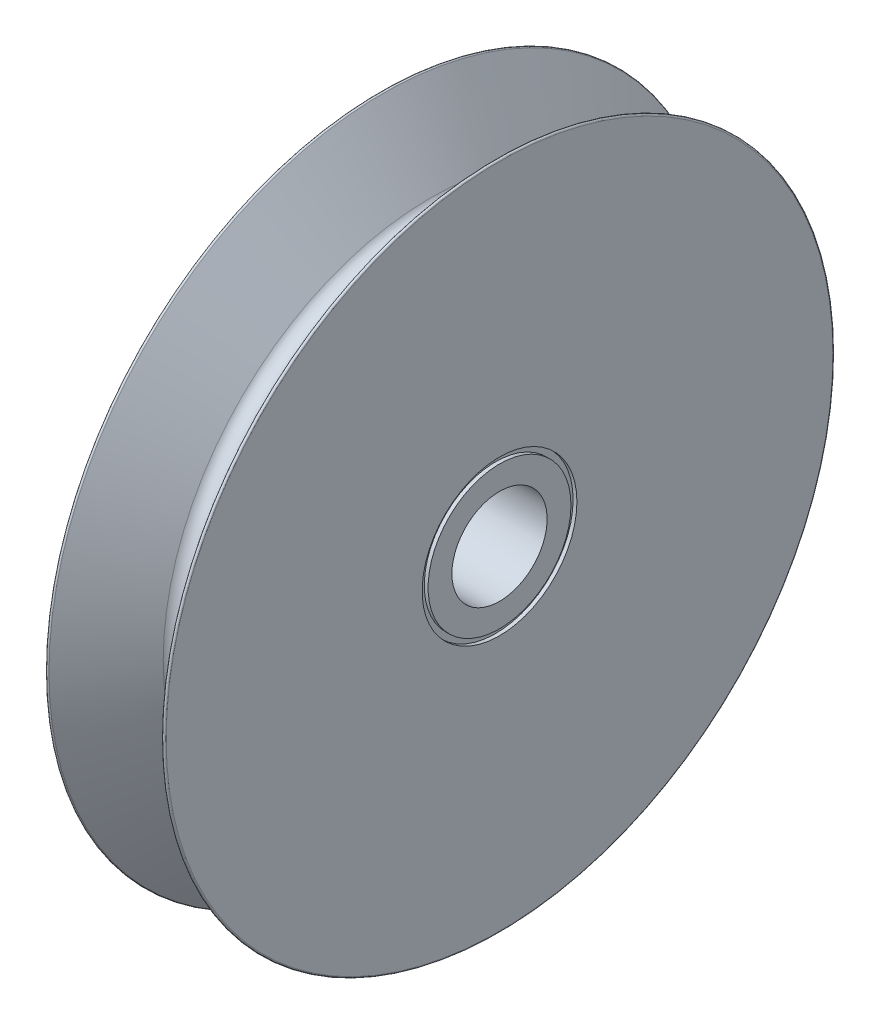
ISO-10303-21;
HEADER;
FILE_DESCRIPTION(('STEP AP214'),'2;1');
FILE_NAME('part.step','',(''),(''),'','','');
FILE_SCHEMA(('AUTOMOTIVE_DESIGN { 1 0 10303 214 1 1 1 1 }'));
ENDSEC;
DATA;
#1=APPLICATION_CONTEXT('core data for automotive mechanical design processes');
#2=APPLICATION_PROTOCOL_DEFINITION('international standard','automotive_design',2000,#1);
#3=PRODUCT_CONTEXT('',#1,'mechanical');
#4=PRODUCT('Part','Part','',(#3));
#5=PRODUCT_RELATED_PRODUCT_CATEGORY('part','',(#4));
#6=PRODUCT_DEFINITION_FORMATION('','',#4);
#7=PRODUCT_DEFINITION_CONTEXT('part definition',#1,'design');
#8=PRODUCT_DEFINITION('design','',#6,#7);
#9=PRODUCT_DEFINITION_SHAPE('','',#8);
#10=(LENGTH_UNIT() NAMED_UNIT(*) SI_UNIT(.MILLI.,.METRE.));
#11=(NAMED_UNIT(*) PLANE_ANGLE_UNIT() SI_UNIT($,.RADIAN.));
#12=(NAMED_UNIT(*) SI_UNIT($,.STERADIAN.) SOLID_ANGLE_UNIT());
#13=UNCERTAINTY_MEASURE_WITH_UNIT(LENGTH_MEASURE(1.E-05),#10,'distance_accuracy_value','');
#14=(GEOMETRIC_REPRESENTATION_CONTEXT(3) GLOBAL_UNCERTAINTY_ASSIGNED_CONTEXT((#13)) GLOBAL_UNIT_ASSIGNED_CONTEXT((#10,
#11,#12)) REPRESENTATION_CONTEXT('',''));
#15=CARTESIAN_POINT('',(0.,0.,0.));
#16=DIRECTION('',(0.,0.,1.));
#17=DIRECTION('',(1.,0.,0.));
#18=AXIS2_PLACEMENT_3D('',#15,#16,#17);
#19=CARTESIAN_POINT('',(0.,22.225,0.));
#20=DIRECTION('',(1.,0.,0.));
#21=DIRECTION('',(0.,0.,-1.));
#22=AXIS2_PLACEMENT_3D('',#19,#20,#21);
#23=PLANE('',#22);
#24=CARTESIAN_POINT('',(0.,0.,0.));
#25=DIRECTION('',(-1.,0.,0.));
#26=DIRECTION('',(0.,0.,1.));
#27=AXIS2_PLACEMENT_3D('',#24,#25,#26);
#28=CIRCLE('',#27,3.175);
#29=CARTESIAN_POINT('',(0.,0.,3.175));
#30=VERTEX_POINT('',#29);
#31=EDGE_CURVE('E10',#30,#30,#28,.T.);
#32=ORIENTED_EDGE('',*,*,#31,.F.);
#33=EDGE_LOOP('',(#32));
#34=FACE_BOUND('',#33,.T.);
#35=CARTESIAN_POINT('',(0.,0.,0.));
#36=DIRECTION('',(-1.,0.,0.));
#37=DIRECTION('',(0.,0.,1.));
#38=AXIS2_PLACEMENT_3D('',#35,#36,#37);
#39=CIRCLE('',#38,4.7625);
#40=CARTESIAN_POINT('',(0.,0.,4.7625));
#41=VERTEX_POINT('',#40);
#42=EDGE_CURVE('E83',#41,#41,#39,.T.);
#43=ORIENTED_EDGE('',*,*,#42,.T.);
#44=EDGE_LOOP('',(#43));
#45=FACE_BOUND('',#44,.T.);
#46=ADVANCED_FACE('F32',(#34,#45),#23,.F.);
#47=CARTESIAN_POINT('',(7.9375,3.175,0.));
#48=DIRECTION('',(-1.,0.,0.));
#49=DIRECTION('',(0.,0.,1.));
#50=AXIS2_PLACEMENT_3D('',#47,#48,#49);
#51=PLANE('',#50);
#52=CARTESIAN_POINT('',(7.9375,0.,0.));
#53=DIRECTION('',(-1.,0.,0.));
#54=DIRECTION('',(0.,0.,1.));
#55=AXIS2_PLACEMENT_3D('',#52,#53,#54);
#56=CIRCLE('',#55,3.175);
#57=CARTESIAN_POINT('',(7.9375,0.,3.175));
#58=VERTEX_POINT('',#57);
#59=EDGE_CURVE('E39',#58,#58,#56,.T.);
#60=ORIENTED_EDGE('',*,*,#59,.T.);
#61=EDGE_LOOP('',(#60));
#62=FACE_BOUND('',#61,.T.);
#63=CARTESIAN_POINT('',(7.9375,0.,0.));
#64=DIRECTION('',(1.,0.,0.));
#65=DIRECTION('',(0.,0.,-1.));
#66=AXIS2_PLACEMENT_3D('',#63,#64,#65);
#67=CIRCLE('',#66,4.7625);
#68=CARTESIAN_POINT('',(7.9375,0.,-4.7625));
#69=VERTEX_POINT('',#68);
#70=EDGE_CURVE('E71',#69,#69,#67,.T.);
#71=ORIENTED_EDGE('',*,*,#70,.T.);
#72=EDGE_LOOP('',(#71));
#73=FACE_BOUND('',#72,.T.);
#74=ADVANCED_FACE('F108',(#62,#73),#51,.F.);
#75=CARTESIAN_POINT('',(0.,0.,0.));
#76=DIRECTION('',(-1.,0.,0.));
#77=DIRECTION('',(0.,0.,1.));
#78=AXIS2_PLACEMENT_3D('',#75,#76,#77);
#79=CIRCLE('',#78,5.159375);
#80=CARTESIAN_POINT('',(0.,0.,5.159375));
#81=VERTEX_POINT('',#80);
#82=EDGE_CURVE('E77',#81,#81,#79,.T.);
#83=ORIENTED_EDGE('',*,*,#82,.F.);
#84=EDGE_LOOP('',(#83));
#85=FACE_BOUND('',#84,.T.);
#86=CARTESIAN_POINT('',(0.,0.,0.));
#87=DIRECTION('',(-1.,0.,0.));
#88=DIRECTION('',(0.,0.,1.));
#89=AXIS2_PLACEMENT_3D('',#86,#87,#88);
#90=CIRCLE('',#89,22.225);
#91=CARTESIAN_POINT('',(0.,0.,22.225));
#92=VERTEX_POINT('',#91);
#93=EDGE_CURVE('E61',#92,#92,#90,.T.);
#94=ORIENTED_EDGE('',*,*,#93,.T.);
#95=EDGE_LOOP('',(#94));
#96=FACE_BOUND('',#95,.T.);
#97=ADVANCED_FACE('F34',(#85,#96),#23,.F.);
#98=CARTESIAN_POINT('',(0.,0.,0.));
#99=DIRECTION('',(-1.,0.,0.));
#100=DIRECTION('',(0.,0.,1.));
#101=AXIS2_PLACEMENT_3D('',#98,#99,#100);
#102=CYLINDRICAL_SURFACE('',#101,3.175);
#103=ORIENTED_EDGE('',*,*,#59,.F.);
#104=EDGE_LOOP('',(#103));
#105=FACE_BOUND('',#104,.T.);
#106=ORIENTED_EDGE('',*,*,#31,.T.);
#107=EDGE_LOOP('',(#106));
#108=FACE_BOUND('',#107,.T.);
#109=ADVANCED_FACE('F107',(#105,#108),#102,.F.);
#110=CARTESIAN_POINT('',(7.9375,0.,0.));
#111=DIRECTION('',(1.,0.,0.));
#112=DIRECTION('',(0.,0.,-1.));
#113=AXIS2_PLACEMENT_3D('',#110,#111,#112);
#114=CIRCLE('',#113,5.159375);
#115=CARTESIAN_POINT('',(7.9375,0.,-5.159375));
#116=VERTEX_POINT('',#115);
#117=EDGE_CURVE('E65',#116,#116,#114,.T.);
#118=ORIENTED_EDGE('',*,*,#117,.F.);
#119=EDGE_LOOP('',(#118));
#120=FACE_BOUND('',#119,.T.);
#121=CARTESIAN_POINT('',(7.9375,0.,0.));
#122=DIRECTION('',(-1.,0.,0.));
#123=DIRECTION('',(0.,0.,1.));
#124=AXIS2_PLACEMENT_3D('',#121,#122,#123);
#125=CIRCLE('',#124,22.225);
#126=CARTESIAN_POINT('',(7.9375,0.,22.225));
#127=VERTEX_POINT('',#126);
#128=EDGE_CURVE('E43',#127,#127,#125,.T.);
#129=ORIENTED_EDGE('',*,*,#128,.F.);
#130=EDGE_LOOP('',(#129));
#131=FACE_BOUND('',#130,.T.);
#132=ADVANCED_FACE('F139',(#120,#131),#51,.F.);
#133=CARTESIAN_POINT('',(7.8375,0.,0.));
#134=DIRECTION('',(-1.,0.,0.));
#135=DIRECTION('',(0.,0.,1.));
#136=AXIS2_PLACEMENT_3D('',#133,#134,#135);
#137=TOROIDAL_SURFACE('',#136,22.225,0.1);
#138=CARTESIAN_POINT('',(7.75557392299746,0.,0.));
#139=DIRECTION('',(-1.,0.,0.));
#140=DIRECTION('',(0.,0.,1.));
#141=AXIS2_PLACEMENT_3D('',#138,#139,#140);
#142=CIRCLE('',#141,22.2823421128576);
#143=CARTESIAN_POINT('',(7.75557392299746,0.,22.2823421128576));
#144=VERTEX_POINT('',#143);
#145=EDGE_CURVE('E47',#144,#144,#142,.T.);
#146=ORIENTED_EDGE('',*,*,#145,.F.);
#147=EDGE_LOOP('',(#146));
#148=FACE_BOUND('',#147,.T.);
#149=ORIENTED_EDGE('',*,*,#128,.T.);
#150=EDGE_LOOP('',(#149));
#151=FACE_BOUND('',#150,.T.);
#152=ADVANCED_FACE('F133',(#148,#151),#137,.T.);
#153=CARTESIAN_POINT('',(7.75557392299746,0.,0.));
#154=DIRECTION('',(1.,0.,0.));
#155=DIRECTION('',(0.,0.,-1.));
#156=AXIS2_PLACEMENT_3D('',#153,#154,#155);
#157=CONICAL_SURFACE('',#156,22.2823421128576,0.96012067179991);
#158=CARTESIAN_POINT('',(4.61903823620769,0.,0.));
#159=DIRECTION('',(-1.,0.,0.));
#160=DIRECTION('',(0.,0.,1.));
#161=AXIS2_PLACEMENT_3D('',#158,#159,#160);
#162=CIRCLE('',#161,17.8010969791928);
#163=CARTESIAN_POINT('',(4.61903823620769,0.,17.8010969791928));
#164=VERTEX_POINT('',#163);
#165=EDGE_CURVE('E52',#164,#164,#162,.T.);
#166=ORIENTED_EDGE('',*,*,#165,.F.);
#167=EDGE_LOOP('',(#166));
#168=FACE_BOUND('',#167,.T.);
#169=ORIENTED_EDGE('',*,*,#145,.T.);
#170=EDGE_LOOP('',(#169));
#171=FACE_BOUND('',#170,.T.);
#172=ADVANCED_FACE('F127',(#168,#171),#157,.T.);
#173=CARTESIAN_POINT('',(3.96875,0.,0.));
#174=DIRECTION('',(-1.,0.,0.));
#175=DIRECTION('',(0.,0.,1.));
#176=AXIS2_PLACEMENT_3D('',#173,#174,#175);
#177=TOROIDAL_SURFACE('',#176,18.25625,0.793749999999999);
#178=CARTESIAN_POINT('',(3.31846176379231,0.,0.));
#179=DIRECTION('',(-1.,0.,0.));
#180=DIRECTION('',(0.,0.,1.));
#181=AXIS2_PLACEMENT_3D('',#178,#179,#180);
#182=CIRCLE('',#181,17.8010969791928);
#183=CARTESIAN_POINT('',(3.31846176379231,0.,17.8010969791928));
#184=VERTEX_POINT('',#183);
#185=EDGE_CURVE('E55',#184,#184,#182,.T.);
#186=ORIENTED_EDGE('',*,*,#185,.F.);
#187=EDGE_LOOP('',(#186));
#188=FACE_BOUND('',#187,.T.);
#189=ORIENTED_EDGE('',*,*,#165,.T.);
#190=EDGE_LOOP('',(#189));
#191=FACE_BOUND('',#190,.T.);
#192=ADVANCED_FACE('F121',(#188,#191),#177,.F.);
#193=CARTESIAN_POINT('',(3.31846176379231,0.,0.));
#194=DIRECTION('',(-1.,0.,0.));
#195=DIRECTION('',(0.,0.,1.));
#196=AXIS2_PLACEMENT_3D('',#193,#194,#195);
#197=CONICAL_SURFACE('',#196,17.8010969791928,0.96012067179991);
#198=CARTESIAN_POINT('',(0.181926077002543,0.,0.));
#199=DIRECTION('',(-1.,0.,0.));
#200=DIRECTION('',(0.,0.,1.));
#201=AXIS2_PLACEMENT_3D('',#198,#199,#200);
#202=CIRCLE('',#201,22.2823421128576);
#203=CARTESIAN_POINT('',(0.181926077002543,0.,22.2823421128576));
#204=VERTEX_POINT('',#203);
#205=EDGE_CURVE('E58',#204,#204,#202,.T.);
#206=ORIENTED_EDGE('',*,*,#205,.F.);
#207=EDGE_LOOP('',(#206));
#208=FACE_BOUND('',#207,.T.);
#209=ORIENTED_EDGE('',*,*,#185,.T.);
#210=EDGE_LOOP('',(#209));
#211=FACE_BOUND('',#210,.T.);
#212=ADVANCED_FACE('F115',(#208,#211),#197,.T.);
#213=CARTESIAN_POINT('',(0.1,0.,0.));
#214=DIRECTION('',(-1.,0.,0.));
#215=DIRECTION('',(0.,0.,1.));
#216=AXIS2_PLACEMENT_3D('',#213,#214,#215);
#217=TOROIDAL_SURFACE('',#216,22.225,0.0999999999999999);
#218=ORIENTED_EDGE('',*,*,#93,.F.);
#219=EDGE_LOOP('',(#218));
#220=FACE_BOUND('',#219,.T.);
#221=ORIENTED_EDGE('',*,*,#205,.T.);
#222=EDGE_LOOP('',(#221));
#223=FACE_BOUND('',#222,.T.);
#224=ADVANCED_FACE('F111',(#220,#223),#217,.T.);
#225=CARTESIAN_POINT('',(7.6835,0.,0.));
#226=DIRECTION('',(1.,0.,0.));
#227=DIRECTION('',(0.,0.,-1.));
#228=AXIS2_PLACEMENT_3D('',#225,#226,#227);
#229=CYLINDRICAL_SURFACE('',#228,5.159375);
#230=CARTESIAN_POINT('',(7.6835,0.,0.));
#231=DIRECTION('',(1.,0.,0.));
#232=DIRECTION('',(0.,0.,-1.));
#233=AXIS2_PLACEMENT_3D('',#230,#231,#232);
#234=CIRCLE('',#233,5.159375);
#235=CARTESIAN_POINT('',(7.6835,0.,-5.159375));
#236=VERTEX_POINT('',#235);
#237=EDGE_CURVE('E64',#236,#236,#234,.T.);
#238=ORIENTED_EDGE('',*,*,#237,.F.);
#239=EDGE_LOOP('',(#238));
#240=FACE_BOUND('',#239,.T.);
#241=ORIENTED_EDGE('',*,*,#117,.T.);
#242=EDGE_LOOP('',(#241));
#243=FACE_BOUND('',#242,.T.);
#244=ADVANCED_FACE('F114',(#240,#243),#229,.F.);
#245=CARTESIAN_POINT('',(7.6835,0.,0.));
#246=DIRECTION('',(1.,0.,0.));
#247=DIRECTION('',(0.,0.,-1.));
#248=AXIS2_PLACEMENT_3D('',#245,#246,#247);
#249=PLANE('',#248);
#250=CARTESIAN_POINT('',(7.6835,0.,0.));
#251=DIRECTION('',(1.,0.,0.));
#252=DIRECTION('',(0.,0.,-1.));
#253=AXIS2_PLACEMENT_3D('',#250,#251,#252);
#254=CIRCLE('',#253,4.7625);
#255=CARTESIAN_POINT('',(7.6835,0.,-4.7625));
#256=VERTEX_POINT('',#255);
#257=EDGE_CURVE('E68',#256,#256,#254,.T.);
#258=ORIENTED_EDGE('',*,*,#257,.F.);
#259=EDGE_LOOP('',(#258));
#260=FACE_BOUND('',#259,.T.);
#261=ORIENTED_EDGE('',*,*,#237,.T.);
#262=EDGE_LOOP('',(#261));
#263=FACE_BOUND('',#262,.T.);
#264=ADVANCED_FACE('F165',(#260,#263),#249,.T.);
#265=CARTESIAN_POINT('',(7.6835,0.,0.));
#266=DIRECTION('',(1.,0.,0.));
#267=DIRECTION('',(0.,0.,-1.));
#268=AXIS2_PLACEMENT_3D('',#265,#266,#267);
#269=CYLINDRICAL_SURFACE('',#268,4.7625);
#270=ORIENTED_EDGE('',*,*,#257,.T.);
#271=EDGE_LOOP('',(#270));
#272=FACE_BOUND('',#271,.T.);
#273=ORIENTED_EDGE('',*,*,#70,.F.);
#274=EDGE_LOOP('',(#273));
#275=FACE_BOUND('',#274,.T.);
#276=ADVANCED_FACE('F101',(#272,#275),#269,.T.);
#277=CARTESIAN_POINT('',(0.254,0.,0.));
#278=DIRECTION('',(-1.,0.,0.));
#279=DIRECTION('',(0.,0.,1.));
#280=AXIS2_PLACEMENT_3D('',#277,#278,#279);
#281=CYLINDRICAL_SURFACE('',#280,5.159375);
#282=CARTESIAN_POINT('',(0.254,0.,0.));
#283=DIRECTION('',(-1.,0.,0.));
#284=DIRECTION('',(0.,0.,1.));
#285=AXIS2_PLACEMENT_3D('',#282,#283,#284);
#286=CIRCLE('',#285,5.159375);
#287=CARTESIAN_POINT('',(0.254,0.,5.159375));
#288=VERTEX_POINT('',#287);
#289=EDGE_CURVE('E74',#288,#288,#286,.T.);
#290=ORIENTED_EDGE('',*,*,#289,.F.);
#291=EDGE_LOOP('',(#290));
#292=FACE_BOUND('',#291,.T.);
#293=ORIENTED_EDGE('',*,*,#82,.T.);
#294=EDGE_LOOP('',(#293));
#295=FACE_BOUND('',#294,.T.);
#296=ADVANCED_FACE('F95',(#292,#295),#281,.F.);
#297=CARTESIAN_POINT('',(0.254,0.,0.));
#298=DIRECTION('',(-1.,0.,0.));
#299=DIRECTION('',(0.,0.,1.));
#300=AXIS2_PLACEMENT_3D('',#297,#298,#299);
#301=PLANE('',#300);
#302=CARTESIAN_POINT('',(0.254,0.,0.));
#303=DIRECTION('',(-1.,0.,0.));
#304=DIRECTION('',(0.,0.,1.));
#305=AXIS2_PLACEMENT_3D('',#302,#303,#304);
#306=CIRCLE('',#305,4.7625);
#307=CARTESIAN_POINT('',(0.254,0.,4.7625));
#308=VERTEX_POINT('',#307);
#309=EDGE_CURVE('E80',#308,#308,#306,.T.);
#310=ORIENTED_EDGE('',*,*,#309,.F.);
#311=EDGE_LOOP('',(#310));
#312=FACE_BOUND('',#311,.T.);
#313=ORIENTED_EDGE('',*,*,#289,.T.);
#314=EDGE_LOOP('',(#313));
#315=FACE_BOUND('',#314,.T.);
#316=ADVANCED_FACE('F92',(#312,#315),#301,.T.);
#317=CARTESIAN_POINT('',(0.254,0.,0.));
#318=DIRECTION('',(-1.,0.,0.));
#319=DIRECTION('',(0.,0.,1.));
#320=AXIS2_PLACEMENT_3D('',#317,#318,#319);
#321=CYLINDRICAL_SURFACE('',#320,4.7625);
#322=ORIENTED_EDGE('',*,*,#309,.T.);
#323=EDGE_LOOP('',(#322));
#324=FACE_BOUND('',#323,.T.);
#325=ORIENTED_EDGE('',*,*,#42,.F.);
#326=EDGE_LOOP('',(#325));
#327=FACE_BOUND('',#326,.T.);
#328=ADVANCED_FACE('F89',(#324,#327),#321,.T.);
#329=CLOSED_SHELL('',(#46,#74,#97,#109,#132,#152,#172,#192,#212,#224,#244,#264,#276,#296,#316,#328));
#330=MANIFOLD_SOLID_BREP('B2',#329);
#331=ADVANCED_BREP_SHAPE_REPRESENTATION('',(#18,#330),#14);
#332=SHAPE_DEFINITION_REPRESENTATION(#9,#331);
ENDSEC;
END-ISO-10303-21;
